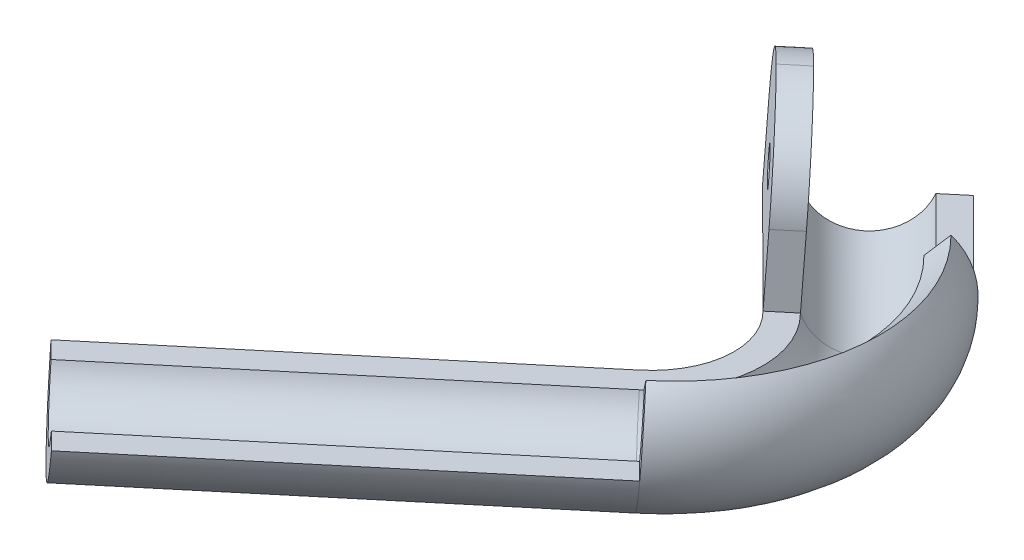
ISO-10303-21;
HEADER;
FILE_DESCRIPTION(('STEP AP214'),'2;1');
FILE_NAME('part.step','',(''),(''),'','','');
FILE_SCHEMA(('AUTOMOTIVE_DESIGN { 1 0 10303 214 1 1 1 1 }'));
ENDSEC;
DATA;
#1=APPLICATION_CONTEXT('core data for automotive mechanical design processes');
#2=APPLICATION_PROTOCOL_DEFINITION('international standard','automotive_design',2000,#1);
#3=PRODUCT_CONTEXT('',#1,'mechanical');
#4=PRODUCT('Part','Part','',(#3));
#5=PRODUCT_RELATED_PRODUCT_CATEGORY('part','',(#4));
#6=PRODUCT_DEFINITION_FORMATION('','',#4);
#7=PRODUCT_DEFINITION_CONTEXT('part definition',#1,'design');
#8=PRODUCT_DEFINITION('design','',#6,#7);
#9=PRODUCT_DEFINITION_SHAPE('','',#8);
#10=(LENGTH_UNIT() NAMED_UNIT(*) SI_UNIT(.MILLI.,.METRE.));
#11=(NAMED_UNIT(*) PLANE_ANGLE_UNIT() SI_UNIT($,.RADIAN.));
#12=(NAMED_UNIT(*) SI_UNIT($,.STERADIAN.) SOLID_ANGLE_UNIT());
#13=UNCERTAINTY_MEASURE_WITH_UNIT(LENGTH_MEASURE(1.E-05),#10,'distance_accuracy_value','');
#14=(GEOMETRIC_REPRESENTATION_CONTEXT(3) GLOBAL_UNCERTAINTY_ASSIGNED_CONTEXT((#13)) GLOBAL_UNIT_ASSIGNED_CONTEXT((#10,
#11,#12)) REPRESENTATION_CONTEXT('',''));
#15=CARTESIAN_POINT('',(0.,0.,0.));
#16=DIRECTION('',(0.,0.,1.));
#17=DIRECTION('',(1.,0.,0.));
#18=AXIS2_PLACEMENT_3D('',#15,#16,#17);
#19=CARTESIAN_POINT('',(82.4990350835093,-9.96194698091742,0.871557427476896));
#20=DIRECTION('',(0.,0.996194698091752,-0.0871557427475884));
#21=DIRECTION('',(0.,0.0871557427475884,0.996194698091752));
#22=AXIS2_PLACEMENT_3D('',#19,#20,#21);
#23=PLANE('',#22);
#24=CARTESIAN_POINT('',(-95.4929658551369,-9.96194698092071,0.871557427478437));
#25=DIRECTION('',(0.,0.996194698091752,-0.0871557427475884));
#26=DIRECTION('',(0.,0.0871557427475884,0.996194698091752));
#27=AXIS2_PLACEMENT_3D('',#24,#25,#26);
#28=CIRCLE('',#27,67.2086946076773);
#29=CARTESIAN_POINT('',(-47.9692421433539,-14.1039124191486,-46.4713241677791));
#30=VERTEX_POINT('',#29);
#31=CARTESIAN_POINT('',(-47.9692421433534,-5.81998154268142,48.2144390227327));
#32=VERTEX_POINT('',#31);
#33=EDGE_CURVE('E208',#30,#32,#28,.F.);
#34=ORIENTED_EDGE('',*,*,#33,.F.);
#35=DIRECTION('',(0.707106781186543,-0.061628416716173,-0.704416026402768));
#36=VECTOR('',#35,1.);
#37=CARTESIAN_POINT('',(-47.9692421433539,-14.1039124191486,-46.4713241677791));
#38=LINE('',#37,#36);
#39=CARTESIAN_POINT('',(-58.9934262583317,-13.1430914644215,-35.4890904016508));
#40=VERTEX_POINT('',#39);
#41=EDGE_CURVE('E179',#40,#30,#38,.T.);
#42=ORIENTED_EDGE('',*,*,#41,.F.);
#43=CARTESIAN_POINT('',(-95.4929658551369,-9.96194698091291,0.871557427477754));
#44=DIRECTION('',(0.,0.996194698091752,-0.0871557427475884));
#45=DIRECTION('',(0.,0.0871557427475884,0.996194698091752));
#46=AXIS2_PLACEMENT_3D('',#43,#44,#45);
#47=CIRCLE('',#46,51.6181439181758);
#48=CARTESIAN_POINT('',(-58.993426258332,-6.78080249740858,37.2322052566039));
#49=VERTEX_POINT('',#48);
#50=EDGE_CURVE('E204',#40,#49,#47,.F.);
#51=ORIENTED_EDGE('',*,*,#50,.T.);
#52=DIRECTION('',(0.707106781186543,-0.0616284167162295,-0.704416026402762));
#53=VECTOR('',#52,1.);
#54=CARTESIAN_POINT('',(-232.234587649035,8.31815959806764,209.814131725281));
#55=LINE('',#54,#53);
#56=CARTESIAN_POINT('',(-232.234587649035,8.31815959806764,209.814131725281));
#57=VERTEX_POINT('',#56);
#58=EDGE_CURVE('E285',#57,#49,#55,.T.);
#59=ORIENTED_EDGE('',*,*,#58,.F.);
#60=DIRECTION('',(-0.707106781186552,-0.0616284167161708,-0.704416026402759));
#61=VECTOR('',#60,1.);
#62=CARTESIAN_POINT('',(-220.987644318272,9.29839529770038,221.018277041125));
#63=LINE('',#62,#61);
#64=CARTESIAN_POINT('',(-221.210403534057,9.2789805527948,220.796365491409));
#65=VERTEX_POINT('',#64);
#66=EDGE_CURVE('E276',#65,#57,#63,.T.);
#67=ORIENTED_EDGE('',*,*,#66,.F.);
#68=DIRECTION('',(0.707106781186543,-0.0616284167162295,-0.704416026402762));
#69=VECTOR('',#68,1.);
#70=CARTESIAN_POINT('',(-221.210403534057,9.2789805527948,220.796365491409));
#71=LINE('',#70,#69);
#72=EDGE_CURVE('E231',#65,#32,#71,.T.);
#73=ORIENTED_EDGE('',*,*,#72,.T.);
#74=EDGE_LOOP('',(#34,#42,#51,#59,#67,#73));
#75=FACE_BOUND('',#74,.T.);
#76=ADVANCED_FACE('F83',(#75),#23,.T.);
#77=CARTESIAN_POINT('',(-27.9692421433544,-5.88508029318755,-67.2667755570903));
#78=DIRECTION('',(0.707106781186554,0.0616284167162236,0.704416026402752));
#79=DIRECTION('',(0.,-0.996194698091748,0.087155742747626));
#80=AXIS2_PLACEMENT_3D('',#77,#78,#79);
#81=PLANE('',#80);
#82=DIRECTION('',(0.707106781186541,-0.0616284167164201,-0.704416026402748));
#83=VECTOR('',#82,1.);
#84=CARTESIAN_POINT('',(-47.7464829275704,-14.1233271640584,-46.6932357174933));
#85=LINE('',#84,#83);
#86=CARTESIAN_POINT('',(-7.96924214335768,-17.5901421290702,-86.3191120914446));
#87=VERTEX_POINT('',#86);
#88=CARTESIAN_POINT('',(3.05494197161995,-18.5509630838012,-97.3013458575725));
#89=VERTEX_POINT('',#88);
#90=EDGE_CURVE('E184',#87,#89,#85,.T.);
#91=ORIENTED_EDGE('',*,*,#90,.F.);
#92=CARTESIAN_POINT('',(-27.9692421433544,-5.88508029318755,-67.2667755570903));
#93=DIRECTION('',(0.707106781186554,0.0616284167162236,0.704416026402752));
#94=DIRECTION('',(0.,-0.996194698091748,0.087155742747626));
#95=AXIS2_PLACEMENT_3D('',#92,#93,#94);
#96=CIRCLE('',#95,30.);
#97=CARTESIAN_POINT('',(-12.9692421431535,13.9400643576639,-84.058548530154));
#98=VERTEX_POINT('',#97);
#99=EDGE_CURVE('E296',#87,#98,#96,.T.);
#100=ORIENTED_EDGE('',*,*,#99,.T.);
#101=DIRECTION('',(0.499999999999967,0.660838155028968,-0.559725765762076));
#102=VECTOR('',#101,1.);
#103=CARTESIAN_POINT('',(-27.9692421433544,-5.88508029318755,-67.2667755570903));
#104=LINE('',#103,#102);
#105=CARTESIAN_POINT('',(-5.4692421433546,23.8526366831178,-92.4544350163852));
#106=VERTEX_POINT('',#105);
#107=EDGE_CURVE('E219',#98,#106,#104,.T.);
#108=ORIENTED_EDGE('',*,*,#107,.T.);
#109=CARTESIAN_POINT('',(-27.9692421433544,-5.88508029318755,-67.2667755570903));
#110=DIRECTION('',(0.707106781186554,0.0616284167162236,0.704416026402752));
#111=DIRECTION('',(0.,-0.996194698091748,0.087155742747626));
#112=AXIS2_PLACEMENT_3D('',#109,#110,#111);
#113=CIRCLE('',#112,45.);
#114=EDGE_CURVE('E220',#89,#106,#113,.T.);
#115=ORIENTED_EDGE('',*,*,#114,.F.);
#116=EDGE_LOOP('',(#91,#100,#108,#115));
#117=FACE_BOUND('',#116,.T.);
#118=ADVANCED_FACE('F312',(#117),#81,.F.);
#119=CARTESIAN_POINT('',(-27.9692421433542,5.88508029318772,67.2667755570899));
#120=DIRECTION('',(-0.707106781186543,0.0616284167162295,0.704416026402762));
#121=DIRECTION('',(0.,-0.996194698091748,0.0871557427476309));
#122=AXIS2_PLACEMENT_3D('',#119,#120,#121);
#123=PLANE('',#122);
#124=CARTESIAN_POINT('',(-27.9692421433542,5.88508029318772,67.2667755570899));
#125=DIRECTION('',(-0.707106781186543,0.0616284167162295,0.704416026402762));
#126=DIRECTION('',(0.,-0.996194698091748,0.0871557427476309));
#127=AXIS2_PLACEMENT_3D('',#124,#125,#126);
#128=CIRCLE('',#127,30.);
#129=CARTESIAN_POINT('',(-7.96924214335905,-2.33375183279634,88.0622269463982));
#130=VERTEX_POINT('',#129);
#131=CARTESIAN_POINT('',(-12.9692421431527,28.3248972264933,80.3608435271799));
#132=VERTEX_POINT('',#131);
#133=EDGE_CURVE('E293',#130,#132,#128,.T.);
#134=ORIENTED_EDGE('',*,*,#133,.F.);
#135=DIRECTION('',(0.707106781186552,0.0616284167159205,0.704416026402781));
#136=VECTOR('',#135,1.);
#137=CARTESIAN_POINT('',(-47.7464829275705,-5.8005667977799,48.436350572447));
#138=LINE('',#137,#136);
#139=CARTESIAN_POINT('',(3.05494197161918,-1.37293087807314,99.044460712527));
#140=VERTEX_POINT('',#139);
#141=EDGE_CURVE('E270',#130,#140,#138,.T.);
#142=ORIENTED_EDGE('',*,*,#141,.T.);
#143=CARTESIAN_POINT('',(-27.9692421433542,5.88508029318772,67.2667755570899));
#144=DIRECTION('',(-0.707106781186543,0.0616284167162295,0.704416026402762));
#145=DIRECTION('',(0.,-0.996194698091748,0.0871557427476309));
#146=AXIS2_PLACEMENT_3D('',#143,#144,#145);
#147=CIRCLE('',#146,45.);
#148=CARTESIAN_POINT('',(-5.4692421433526,39.544805693128,86.9078775119257));
#149=VERTEX_POINT('',#148);
#150=EDGE_CURVE('E288',#140,#149,#147,.T.);
#151=ORIENTED_EDGE('',*,*,#150,.T.);
#152=DIRECTION('',(0.500000000000031,0.747993897776556,0.436468932329672));
#153=VECTOR('',#152,1.);
#154=CARTESIAN_POINT('',(-27.9692421433542,5.88508029318773,67.2667755570899));
#155=LINE('',#154,#153);
#156=EDGE_CURVE('E225',#132,#149,#155,.T.);
#157=ORIENTED_EDGE('',*,*,#156,.F.);
#158=EDGE_LOOP('',(#134,#142,#151,#157));
#159=FACE_BOUND('',#158,.T.);
#160=ADVANCED_FACE('F321',(#159),#123,.T.);
#161=CARTESIAN_POINT('',(-95.4929658551369,4.77395900588817E-12,1.8552867575572E-12));
#162=DIRECTION('',(0.,0.996194698091752,-0.0871557427475884));
#163=DIRECTION('',(1.,0.,0.));
#164=AXIS2_PLACEMENT_3D('',#161,#162,#163);
#165=TOROIDAL_SURFACE('',#164,95.4929658551364,45.);
#166=ORIENTED_EDGE('',*,*,#50,.F.);
#167=EDGE_CURVE('E213',#40,#89,#113,.T.);
#168=ORIENTED_EDGE('',*,*,#167,.T.);
#169=ORIENTED_EDGE('',*,*,#114,.T.);
#170=CARTESIAN_POINT('',(-95.4929658551368,31.6987211881245,-2.77327875222539));
#171=DIRECTION('',(0.,0.996194698091752,-0.0871557427475884));
#172=DIRECTION('',(0.,0.0871557427475884,0.996194698091752));
#173=AXIS2_PLACEMENT_3D('',#170,#171,#172);
#174=CIRCLE('',#173,127.312771008536);
#175=EDGE_CURVE('E299',#106,#149,#174,.F.);
#176=ORIENTED_EDGE('',*,*,#175,.T.);
#177=ORIENTED_EDGE('',*,*,#150,.F.);
#178=EDGE_CURVE('E224',#49,#140,#147,.T.);
#179=ORIENTED_EDGE('',*,*,#178,.F.);
#180=EDGE_LOOP('',(#166,#168,#169,#176,#177,#179));
#181=FACE_BOUND('',#180,.T.);
#182=ADVANCED_FACE('F222',(#181),#165,.T.);
#183=CARTESIAN_POINT('',(-95.4929658551369,4.77395900588817E-12,1.8552867575572E-12));
#184=DIRECTION('',(0.,0.996194698091752,-0.0871557427475884));
#185=DIRECTION('',(1.,0.,0.));
#186=AXIS2_PLACEMENT_3D('',#183,#184,#185);
#187=TOROIDAL_SURFACE('',#186,95.4929658551364,30.);
#188=EDGE_CURVE('E294',#30,#87,#96,.T.);
#189=ORIENTED_EDGE('',*,*,#188,.F.);
#190=ORIENTED_EDGE('',*,*,#33,.T.);
#191=EDGE_CURVE('E290',#32,#130,#128,.T.);
#192=ORIENTED_EDGE('',*,*,#191,.T.);
#193=ORIENTED_EDGE('',*,*,#133,.T.);
#194=CARTESIAN_POINT('',(-95.4929658551368,21.1324807920793,-1.84885250148251));
#195=DIRECTION('',(0.,0.996194698091752,-0.0871557427475884));
#196=DIRECTION('',(0.,0.0871557427475884,0.996194698091752));
#197=AXIS2_PLACEMENT_3D('',#194,#195,#196);
#198=CIRCLE('',#197,116.706169291306);
#199=EDGE_CURVE('E229',#98,#132,#198,.F.);
#200=ORIENTED_EDGE('',*,*,#199,.F.);
#201=ORIENTED_EDGE('',*,*,#99,.F.);
#202=EDGE_LOOP('',(#189,#190,#192,#193,#200,#201));
#203=FACE_BOUND('',#202,.T.);
#204=ADVANCED_FACE('F302',(#203),#187,.F.);
#205=CARTESIAN_POINT('',(-95.4929658551368,14.6454535179064,-1.28131115500937));
#206=DIRECTION('',(0.,0.996194698091752,-0.0871557427475884));
#207=DIRECTION('',(0.,0.0871557427475884,0.996194698091752));
#208=AXIS2_PLACEMENT_3D('',#205,#206,#207);
#209=CONICAL_SURFACE('',#208,110.194362626807,0.785398163397443);
#210=ORIENTED_EDGE('',*,*,#199,.T.);
#211=ORIENTED_EDGE('',*,*,#156,.T.);
#212=ORIENTED_EDGE('',*,*,#175,.F.);
#213=ORIENTED_EDGE('',*,*,#107,.F.);
#214=EDGE_LOOP('',(#210,#211,#212,#213));
#215=FACE_BOUND('',#214,.T.);
#216=ADVANCED_FACE('F318',(#215),#209,.F.);
#217=CARTESIAN_POINT('',(-220.987644318274,9.29839529769633,221.018277041124));
#218=DIRECTION('',(2.18808814604536E-13,0.996194698091763,-0.087155742747454));
#219=DIRECTION('',(0.,0.087155742747454,0.996194698091763));
#220=AXIS2_PLACEMENT_3D('',#217,#218,#219);
#221=PLANE('',#220);
#222=ORIENTED_EDGE('',*,*,#141,.F.);
#223=DIRECTION('',(0.707106781186543,-0.0616284167162295,-0.704416026402762));
#224=VECTOR('',#223,1.);
#225=CARTESIAN_POINT('',(-181.210403534062,12.7652102626799,260.644153415075));
#226=LINE('',#225,#224);
#227=CARTESIAN_POINT('',(-181.210403534062,12.7652102626799,260.644153415075));
#228=VERTEX_POINT('',#227);
#229=EDGE_CURVE('E226',#228,#130,#226,.T.);
#230=ORIENTED_EDGE('',*,*,#229,.F.);
#231=DIRECTION('',(0.707106781186552,0.0616284167159205,0.704416026402781));
#232=VECTOR('',#231,1.);
#233=CARTESIAN_POINT('',(-220.987644318274,9.29839529769633,221.018277041124));
#234=LINE('',#233,#232);
#235=CARTESIAN_POINT('',(-170.186219419084,13.7260312174031,271.626387181204));
#236=VERTEX_POINT('',#235);
#237=EDGE_CURVE('E271',#228,#236,#234,.T.);
#238=ORIENTED_EDGE('',*,*,#237,.T.);
#239=DIRECTION('',(0.707106781186543,-0.0616284167162295,-0.704416026402762));
#240=VECTOR('',#239,1.);
#241=CARTESIAN_POINT('',(-170.186219419084,13.7260312174031,271.626387181204));
#242=LINE('',#241,#240);
#243=EDGE_CURVE('E280',#236,#140,#242,.T.);
#244=ORIENTED_EDGE('',*,*,#243,.T.);
#245=EDGE_LOOP('',(#222,#230,#238,#244));
#246=FACE_BOUND('',#245,.T.);
#247=ADVANCED_FACE('F324',(#246),#221,.T.);
#248=CARTESIAN_POINT('',(-201.210403534057,20.984042388664,239.848702025767));
#249=DIRECTION('',(0.707106781186543,-0.0616284167162295,-0.704416026402762));
#250=DIRECTION('',(-0.705757556807955,0.,-0.708453436019944));
#251=AXIS2_PLACEMENT_3D('',#248,#249,#250);
#252=CYLINDRICAL_SURFACE('',#251,30.);
#253=ORIENTED_EDGE('',*,*,#191,.F.);
#254=ORIENTED_EDGE('',*,*,#72,.F.);
#255=CARTESIAN_POINT('',(-201.210403534057,20.984042388664,239.848702025767));
#256=DIRECTION('',(-0.707106781186544,0.0616284167162295,0.704416026402762));
#257=DIRECTION('',(0.705757556807955,0.,0.708453436019944));
#258=AXIS2_PLACEMENT_3D('',#255,#256,#257);
#259=CIRCLE('',#258,30.);
#260=EDGE_CURVE('E274',#228,#65,#259,.F.);
#261=ORIENTED_EDGE('',*,*,#260,.F.);
#262=ORIENTED_EDGE('',*,*,#229,.T.);
#263=EDGE_LOOP('',(#253,#254,#261,#262));
#264=FACE_BOUND('',#263,.T.);
#265=ADVANCED_FACE('F336',(#264),#252,.F.);
#266=CARTESIAN_POINT('',(-201.210403534057,20.984042388664,239.848702025767));
#267=DIRECTION('',(0.707106781186543,-0.0616284167162295,-0.704416026402762));
#268=DIRECTION('',(-0.705757556807955,0.,-0.708453436019944));
#269=AXIS2_PLACEMENT_3D('',#266,#267,#268);
#270=CYLINDRICAL_SURFACE('',#269,45.);
#271=ORIENTED_EDGE('',*,*,#178,.T.);
#272=ORIENTED_EDGE('',*,*,#243,.F.);
#273=CARTESIAN_POINT('',(-201.210403534057,20.984042388664,239.848702025767));
#274=DIRECTION('',(-0.707106781186544,0.0616284167162295,0.704416026402762));
#275=DIRECTION('',(0.705757556807955,0.,0.708453436019944));
#276=AXIS2_PLACEMENT_3D('',#273,#274,#275);
#277=CIRCLE('',#276,45.);
#278=EDGE_CURVE('E278',#57,#236,#277,.T.);
#279=ORIENTED_EDGE('',*,*,#278,.F.);
#280=ORIENTED_EDGE('',*,*,#58,.T.);
#281=EDGE_LOOP('',(#271,#272,#279,#280));
#282=FACE_BOUND('',#281,.T.);
#283=ADVANCED_FACE('F330',(#282),#270,.T.);
#284=CARTESIAN_POINT('',(-220.987644318271,19.2603422786175,220.146719613649));
#285=DIRECTION('',(-0.707106781186544,0.0616284167162295,0.704416026402762));
#286=DIRECTION('',(0.705757556807955,0.,0.708453436019944));
#287=AXIS2_PLACEMENT_3D('',#284,#285,#286);
#288=PLANE('',#287);
#289=ORIENTED_EDGE('',*,*,#237,.F.);
#290=ORIENTED_EDGE('',*,*,#260,.T.);
#291=ORIENTED_EDGE('',*,*,#66,.T.);
#292=ORIENTED_EDGE('',*,*,#278,.T.);
#293=EDGE_LOOP('',(#289,#290,#291,#292));
#294=FACE_BOUND('',#293,.T.);
#295=ADVANCED_FACE('F334',(#294),#288,.T.);
#296=CARTESIAN_POINT('',(-98.6799202620099,-12.0479219648099,-137.708378197365));
#297=DIRECTION('',(0.707106781186554,0.0616284167162236,0.704416026402752));
#298=DIRECTION('',(0.705757556807945,0.,-0.708453436019955));
#299=AXIS2_PLACEMENT_3D('',#296,#297,#298);
#300=CYLINDRICAL_SURFACE('',#299,30.);
#301=ORIENTED_EDGE('',*,*,#188,.T.);
#302=DIRECTION('',(0.707106781186554,0.0616284167162236,0.704416026402752));
#303=VECTOR('',#302,1.);
#304=CARTESIAN_POINT('',(-78.6799202620131,-23.7529838006926,-156.76071473172));
#305=LINE('',#304,#303);
#306=CARTESIAN_POINT('',(-78.6799202620131,-23.7529838006926,-156.76071473172));
#307=VERTEX_POINT('',#306);
#308=EDGE_CURVE('E267',#307,#87,#305,.T.);
#309=ORIENTED_EDGE('',*,*,#308,.F.);
#310=CARTESIAN_POINT('',(-98.6799202620099,-12.0479219648099,-137.708378197365));
#311=DIRECTION('',(-0.707106781186554,-0.0616284167162236,-0.704416026402752));
#312=DIRECTION('',(-0.705757556807945,0.,0.708453436019955));
#313=AXIS2_PLACEMENT_3D('',#310,#311,#312);
#314=CIRCLE('',#313,30.);
#315=CARTESIAN_POINT('',(-118.679920262009,-20.2667540907753,-116.912926808054));
#316=VERTEX_POINT('',#315);
#317=EDGE_CURVE('E258',#316,#307,#314,.F.);
#318=ORIENTED_EDGE('',*,*,#317,.F.);
#319=DIRECTION('',(0.707106781186554,0.0616284167162236,0.704416026402752));
#320=VECTOR('',#319,1.);
#321=CARTESIAN_POINT('',(-118.679920262009,-20.2667540907753,-116.912926808054));
#322=LINE('',#321,#320);
#323=EDGE_CURVE('E197',#316,#30,#322,.T.);
#324=ORIENTED_EDGE('',*,*,#323,.T.);
#325=EDGE_LOOP('',(#301,#309,#318,#324));
#326=FACE_BOUND('',#325,.T.);
#327=ADVANCED_FACE('F307',(#326),#300,.F.);
#328=CARTESIAN_POINT('',(-118.457161046226,-20.2861688356808,-117.134838357769));
#329=DIRECTION('',(-1.38665121052206E-13,-0.996194698091733,0.0871557427478031));
#330=DIRECTION('',(0.,-0.0871557427478031,-0.996194698091733));
#331=AXIS2_PLACEMENT_3D('',#328,#329,#330);
#332=PLANE('',#331);
#333=ORIENTED_EDGE('',*,*,#90,.T.);
#334=DIRECTION('',(0.707106781186554,0.0616284167162236,0.704416026402752));
#335=VECTOR('',#334,1.);
#336=CARTESIAN_POINT('',(-67.6557361470355,-24.7138047554235,-167.742948497848));
#337=LINE('',#336,#335);
#338=CARTESIAN_POINT('',(-67.6557361470355,-24.7138047554235,-167.742948497848));
#339=VERTEX_POINT('',#338);
#340=EDGE_CURVE('E196',#339,#89,#337,.T.);
#341=ORIENTED_EDGE('',*,*,#340,.F.);
#342=DIRECTION('',(0.707106781186541,-0.0616284167164201,-0.704416026402748));
#343=VECTOR('',#342,1.);
#344=CARTESIAN_POINT('',(-118.457161046226,-20.2861688356808,-117.134838357769));
#345=LINE('',#344,#343);
#346=EDGE_CURVE('E260',#307,#339,#345,.T.);
#347=ORIENTED_EDGE('',*,*,#346,.F.);
#348=ORIENTED_EDGE('',*,*,#308,.T.);
#349=EDGE_LOOP('',(#333,#341,#347,#348));
#350=FACE_BOUND('',#349,.T.);
#351=ADVANCED_FACE('F310',(#350),#332,.F.);
#352=CARTESIAN_POINT('',(-98.6799202620099,-12.0479219648099,-137.708378197365));
#353=DIRECTION('',(0.707106781186554,0.0616284167162236,0.704416026402752));
#354=DIRECTION('',(0.705757556807945,0.,-0.708453436019955));
#355=AXIS2_PLACEMENT_3D('',#352,#353,#354);
#356=CYLINDRICAL_SURFACE('',#355,45.);
#357=ORIENTED_EDGE('',*,*,#340,.T.);
#358=ORIENTED_EDGE('',*,*,#167,.F.);
#359=DIRECTION('',(0.707106781186554,0.0616284167162236,0.704416026402752));
#360=VECTOR('',#359,1.);
#361=CARTESIAN_POINT('',(-129.704104376987,-19.3059331360442,-105.930693041926));
#362=LINE('',#361,#360);
#363=CARTESIAN_POINT('',(-129.704104376987,-19.3059331360382,-105.930693041927));
#364=VERTEX_POINT('',#363);
#365=EDGE_CURVE('E188',#364,#40,#362,.T.);
#366=ORIENTED_EDGE('',*,*,#365,.F.);
#367=CARTESIAN_POINT('',(-98.6799202620099,-12.0479219648099,-137.708378197365));
#368=DIRECTION('',(-0.707106781186554,-0.0616284167162236,-0.704416026402752));
#369=DIRECTION('',(-0.705757556807945,0.,0.708453436019955));
#370=AXIS2_PLACEMENT_3D('',#367,#368,#369);
#371=CIRCLE('',#370,45.);
#372=EDGE_CURVE('E262',#339,#364,#371,.T.);
#373=ORIENTED_EDGE('',*,*,#372,.F.);
#374=EDGE_LOOP('',(#357,#358,#366,#373));
#375=FACE_BOUND('',#374,.T.);
#376=ADVANCED_FACE('F214',(#375),#356,.T.);
#377=CARTESIAN_POINT('',(-118.457161046224,-10.3242218547633,-118.006395785247));
#378=DIRECTION('',(-0.707106781186554,-0.0616284167162236,-0.704416026402752));
#379=DIRECTION('',(-0.705757556807945,0.,0.708453436019955));
#380=AXIS2_PLACEMENT_3D('',#377,#378,#379);
#381=PLANE('',#380);
#382=DIRECTION('',(0.,-0.996194698091752,0.0871557427475884));
#383=VECTOR('',#382,1.);
#384=CARTESIAN_POINT('',(-129.704104376987,70.3515896922194,-113.77470988921));
#385=LINE('',#384,#383);
#386=CARTESIAN_POINT('',(-129.704104376987,20.541854787629,-109.41692275183));
#387=VERTEX_POINT('',#386);
#388=EDGE_CURVE('E191',#387,#364,#385,.T.);
#389=ORIENTED_EDGE('',*,*,#388,.F.);
#390=DIRECTION('',(-0.707106781186541,0.061628416716173,0.704416026402769));
#391=VECTOR('',#390,1.);
#392=CARTESIAN_POINT('',(-118.679920262011,19.5810338329018,-120.39915651796));
#393=LINE('',#392,#391);
#394=CARTESIAN_POINT('',(-118.679920262009,19.5810338329019,-120.399156517958));
#395=VERTEX_POINT('',#394);
#396=EDGE_CURVE('E240',#387,#395,#393,.F.);
#397=ORIENTED_EDGE('',*,*,#396,.T.);
#398=DIRECTION('',(0.,-0.996194698091752,0.0871557427475884));
#399=VECTOR('',#398,1.);
#400=CARTESIAN_POINT('',(-118.679920262009,69.3907687374923,-124.756943655338));
#401=LINE('',#400,#399);
#402=EDGE_CURVE('E248',#395,#316,#401,.T.);
#403=ORIENTED_EDGE('',*,*,#402,.T.);
#404=ORIENTED_EDGE('',*,*,#317,.T.);
#405=ORIENTED_EDGE('',*,*,#346,.T.);
#406=ORIENTED_EDGE('',*,*,#372,.T.);
#407=EDGE_LOOP('',(#389,#397,#403,#404,#405,#406));
#408=FACE_BOUND('',#407,.T.);
#409=ADVANCED_FACE('F246',(#408),#381,.T.);
#410=CARTESIAN_POINT('',(-58.9934262583314,76.5144313638361,-43.3331072489338));
#411=DIRECTION('',(0.707106781186542,-0.061628416716173,-0.704416026402769));
#412=DIRECTION('',(-0.70575755680796,0.,-0.70845343601994));
#413=AXIS2_PLACEMENT_3D('',#410,#411,#412);
#414=PLANE('',#413);
#415=CARTESIAN_POINT('',(-94.3487653176592,23.6232756234352,-74.1961214316918));
#416=DIRECTION('',(0.707106781186542,-0.061628416716173,-0.704416026402769));
#417=DIRECTION('',(-0.70575755680796,0.,-0.70845343601994));
#418=AXIS2_PLACEMENT_3D('',#415,#416,#417);
#419=CIRCLE('',#418,10.);
#420=CARTESIAN_POINT('',(-101.406340885739,23.6232756234352,-81.2806557918912));
#421=VERTEX_POINT('',#420);
#422=EDGE_CURVE('E210',#421,#421,#419,.T.);
#423=ORIENTED_EDGE('',*,*,#422,.T.);
#424=EDGE_LOOP('',(#423));
#425=FACE_BOUND('',#424,.T.);
#426=CARTESIAN_POINT('',(-94.3487653176592,23.6232756234402,-74.1961214316922));
#427=DIRECTION('',(0.707106781186542,-0.061628416716173,-0.704416026402769));
#428=DIRECTION('',(-0.70575755680796,0.,-0.70845343601994));
#429=AXIS2_PLACEMENT_3D('',#426,#427,#428);
#430=CIRCLE('',#429,50.);
#431=CARTESIAN_POINT('',(-58.9934262583315,26.7046964592485,-38.9753201115543));
#432=VERTEX_POINT('',#431);
#433=CARTESIAN_POINT('',(-94.348765317659,73.4330105280278,-78.5539085690716));
#434=VERTEX_POINT('',#433);
#435=EDGE_CURVE('E236',#432,#434,#430,.F.);
#436=ORIENTED_EDGE('',*,*,#435,.T.);
#437=CARTESIAN_POINT('',(-94.3487653176608,23.62327562344,-74.1961214316938));
#438=DIRECTION('',(0.707106781186542,-0.061628416716173,-0.704416026402769));
#439=DIRECTION('',(-0.70575755680796,0.,-0.70845343601994));
#440=AXIS2_PLACEMENT_3D('',#437,#438,#439);
#441=CIRCLE('',#440,50.);
#442=EDGE_CURVE('E238',#434,#387,#441,.F.);
#443=ORIENTED_EDGE('',*,*,#442,.T.);
#444=ORIENTED_EDGE('',*,*,#388,.T.);
#445=ORIENTED_EDGE('',*,*,#365,.T.);
#446=DIRECTION('',(0.,-0.996194698091752,0.0871557427475884));
#447=VECTOR('',#446,1.);
#448=CARTESIAN_POINT('',(-58.9934262583314,76.5144313638361,-43.3331072489338));
#449=LINE('',#448,#447);
#450=EDGE_CURVE('E175',#432,#40,#449,.T.);
#451=ORIENTED_EDGE('',*,*,#450,.F.);
#452=EDGE_LOOP('',(#436,#443,#444,#445,#451));
#453=FACE_BOUND('',#452,.T.);
#454=ADVANCED_FACE('F189',(#425,#453),#414,.F.);
#455=CARTESIAN_POINT('',(-47.9692421433536,75.553610409109,-54.3153410150621));
#456=DIRECTION('',(-0.707106781186552,-0.0616284167161671,-0.704416026402758));
#457=DIRECTION('',(-0.705757556807949,0.,0.708453436019951));
#458=AXIS2_PLACEMENT_3D('',#455,#456,#457);
#459=PLANE('',#458);
#460=DIRECTION('',(0.,-0.996194698091752,0.0871557427475884));
#461=VECTOR('',#460,1.);
#462=CARTESIAN_POINT('',(-47.9692421433536,75.553610409109,-54.3153410150621));
#463=LINE('',#462,#461);
#464=CARTESIAN_POINT('',(-47.9692421433538,25.7438755045214,-49.9575538776826));
#465=VERTEX_POINT('',#464);
#466=EDGE_CURVE('E185',#465,#30,#463,.T.);
#467=ORIENTED_EDGE('',*,*,#466,.F.);
#468=DIRECTION('',(0.707106781186543,-0.0616284167161728,-0.704416026402768));
#469=VECTOR('',#468,1.);
#470=CARTESIAN_POINT('',(-47.9692421433538,25.7438755045214,-49.9575538776826));
#471=LINE('',#470,#469);
#472=EDGE_CURVE('E13',#465,#432,#471,.F.);
#473=ORIENTED_EDGE('',*,*,#472,.T.);
#474=ORIENTED_EDGE('',*,*,#450,.T.);
#475=ORIENTED_EDGE('',*,*,#41,.T.);
#476=EDGE_LOOP('',(#467,#473,#474,#475));
#477=FACE_BOUND('',#476,.T.);
#478=ADVANCED_FACE('F177',(#477),#459,.F.);
#479=CARTESIAN_POINT('',(-118.679920262009,69.3907687374923,-124.756943655338));
#480=DIRECTION('',(-0.707106781186541,0.0616284167161731,0.704416026402769));
#481=DIRECTION('',(0.705757556807961,0.,0.708453436019939));
#482=AXIS2_PLACEMENT_3D('',#479,#480,#481);
#483=PLANE('',#482);
#484=CARTESIAN_POINT('',(-83.3245812026815,22.6624546687081,-85.1783551978201));
#485=DIRECTION('',(0.707106781186541,-0.0616284167161731,-0.704416026402769));
#486=DIRECTION('',(-0.705757556807961,0.,-0.708453436019939));
#487=AXIS2_PLACEMENT_3D('',#484,#485,#486);
#488=CIRCLE('',#487,10.);
#489=CARTESIAN_POINT('',(-90.3821567707611,22.6624546687081,-92.2628895580195));
#490=VERTEX_POINT('',#489);
#491=EDGE_CURVE('E362',#490,#490,#488,.T.);
#492=ORIENTED_EDGE('',*,*,#491,.F.);
#493=EDGE_LOOP('',(#492));
#494=FACE_BOUND('',#493,.T.);
#495=ORIENTED_EDGE('',*,*,#402,.F.);
#496=CARTESIAN_POINT('',(-83.3245812026831,22.6624546687129,-85.1783551978221));
#497=DIRECTION('',(-0.707106781186541,0.0616284167161731,0.704416026402769));
#498=DIRECTION('',(0.705757556807961,0.,0.708453436019939));
#499=AXIS2_PLACEMENT_3D('',#496,#497,#498);
#500=CIRCLE('',#499,50.);
#501=CARTESIAN_POINT('',(-83.3245812026813,72.4721895733007,-89.5361423351999));
#502=VERTEX_POINT('',#501);
#503=EDGE_CURVE('E92',#395,#502,#500,.F.);
#504=ORIENTED_EDGE('',*,*,#503,.T.);
#505=CARTESIAN_POINT('',(-83.3245812026815,22.6624546687131,-85.1783551978205));
#506=DIRECTION('',(-0.707106781186541,0.0616284167161731,0.704416026402769));
#507=DIRECTION('',(0.705757556807961,0.,0.708453436019939));
#508=AXIS2_PLACEMENT_3D('',#505,#506,#507);
#509=CIRCLE('',#508,50.);
#510=EDGE_CURVE('E99',#502,#465,#509,.F.);
#511=ORIENTED_EDGE('',*,*,#510,.T.);
#512=ORIENTED_EDGE('',*,*,#466,.T.);
#513=ORIENTED_EDGE('',*,*,#323,.F.);
#514=EDGE_LOOP('',(#495,#504,#511,#512,#513));
#515=FACE_BOUND('',#514,.T.);
#516=ADVANCED_FACE('F252',(#494,#515),#483,.F.);
#517=CARTESIAN_POINT('',(-146.96419150947,28.2090121731636,-21.7809128215708));
#518=DIRECTION('',(0.707106781186541,-0.0616284167161731,-0.704416026402769));
#519=DIRECTION('',(-0.705757556807961,0.,-0.708453436019939));
#520=AXIS2_PLACEMENT_3D('',#517,#518,#519);
#521=CYLINDRICAL_SURFACE('',#520,10.);
#522=ORIENTED_EDGE('',*,*,#491,.T.);
#523=EDGE_LOOP('',(#522));
#524=FACE_BOUND('',#523,.T.);
#525=ORIENTED_EDGE('',*,*,#422,.F.);
#526=EDGE_LOOP('',(#525));
#527=FACE_BOUND('',#526,.T.);
#528=ADVANCED_FACE('F358',(#524,#527),#521,.F.);
#529=CARTESIAN_POINT('',(-83.101821986896,22.6430399238074,-85.400266747537));
#530=DIRECTION('',(0.707106781186543,-0.0616284167161728,-0.704416026402768));
#531=DIRECTION('',(-0.705757556807959,0.,-0.708453436019941));
#532=AXIS2_PLACEMENT_3D('',#529,#530,#531);
#533=CYLINDRICAL_SURFACE('',#532,50.);
#534=ORIENTED_EDGE('',*,*,#472,.F.);
#535=ORIENTED_EDGE('',*,*,#510,.F.);
#536=DIRECTION('',(0.707106781186543,-0.0616284167161728,-0.704416026402768));
#537=VECTOR('',#536,1.);
#538=CARTESIAN_POINT('',(-83.1018219868958,72.452774828395,-89.7580538849164));
#539=LINE('',#538,#537);
#540=EDGE_CURVE('E87',#434,#502,#539,.T.);
#541=ORIENTED_EDGE('',*,*,#540,.F.);
#542=ORIENTED_EDGE('',*,*,#435,.F.);
#543=EDGE_LOOP('',(#534,#535,#541,#542));
#544=FACE_BOUND('',#543,.T.);
#545=ADVANCED_FACE('F85',(#544),#533,.T.);
#546=CARTESIAN_POINT('',(-83.1018219868979,22.6430399238073,-85.4002667475385));
#547=DIRECTION('',(0.707106781186541,-0.061628416716173,-0.704416026402769));
#548=DIRECTION('',(-0.705757556807961,0.,-0.708453436019939));
#549=AXIS2_PLACEMENT_3D('',#546,#547,#548);
#550=CYLINDRICAL_SURFACE('',#549,50.);
#551=ORIENTED_EDGE('',*,*,#503,.F.);
#552=ORIENTED_EDGE('',*,*,#396,.F.);
#553=ORIENTED_EDGE('',*,*,#442,.F.);
#554=ORIENTED_EDGE('',*,*,#540,.T.);
#555=EDGE_LOOP('',(#551,#552,#553,#554));
#556=FACE_BOUND('',#555,.T.);
#557=ADVANCED_FACE('F353',(#556),#550,.T.);
#558=CLOSED_SHELL('',(#76,#118,#160,#182,#204,#216,#247,#265,#283,#295,#327,#351,#376,#409,#454,
#478,#516,#528,#545,#557));
#559=MANIFOLD_SOLID_BREP('B2',#558);
#560=ADVANCED_BREP_SHAPE_REPRESENTATION('',(#18,#559),#14);
#561=SHAPE_DEFINITION_REPRESENTATION(#9,#560);
ENDSEC;
END-ISO-10303-21;
